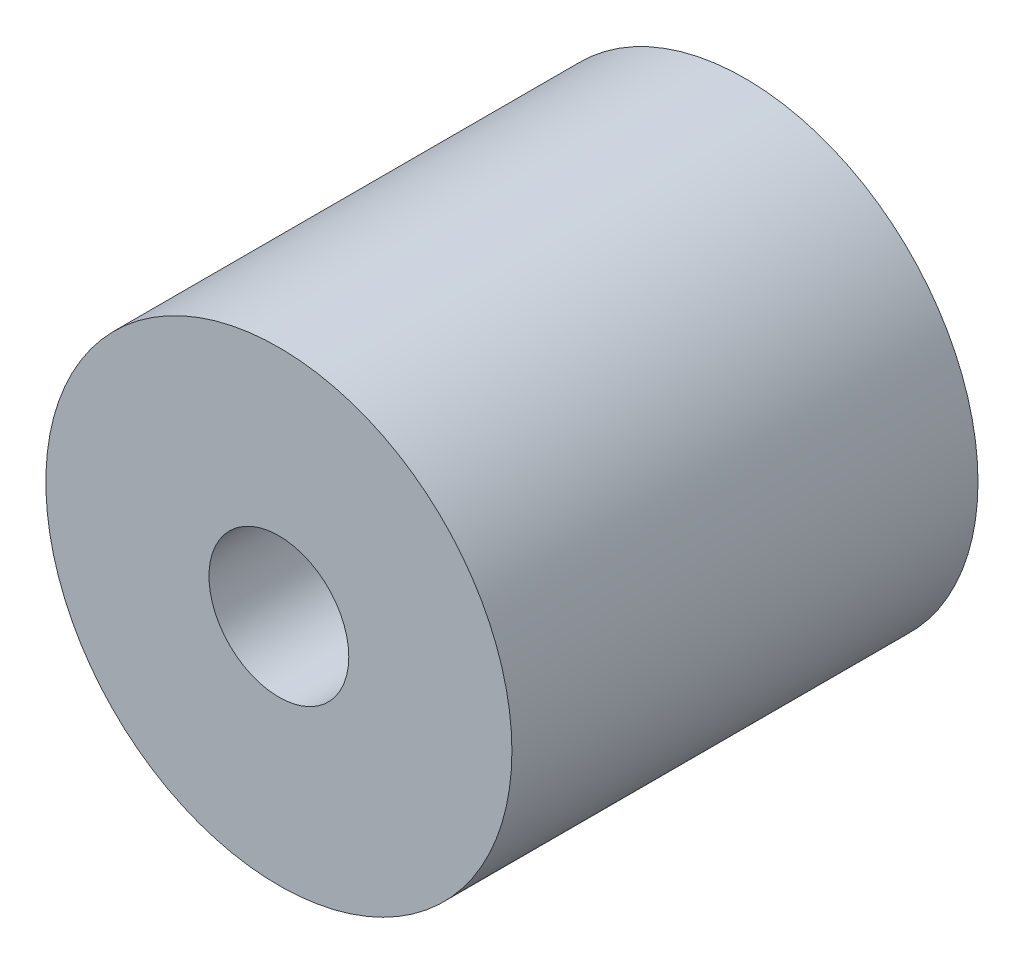
ISO-10303-21;
HEADER;
FILE_DESCRIPTION(('STEP AP214'),'2;1');
FILE_NAME('part.step','',(''),(''),'','','');
FILE_SCHEMA(('AUTOMOTIVE_DESIGN { 1 0 10303 214 1 1 1 1 }'));
ENDSEC;
DATA;
#1=APPLICATION_CONTEXT('core data for automotive mechanical design processes');
#2=APPLICATION_PROTOCOL_DEFINITION('international standard','automotive_design',2000,#1);
#3=PRODUCT_CONTEXT('',#1,'mechanical');
#4=PRODUCT('Part','Part','',(#3));
#5=PRODUCT_RELATED_PRODUCT_CATEGORY('part','',(#4));
#6=PRODUCT_DEFINITION_FORMATION('','',#4);
#7=PRODUCT_DEFINITION_CONTEXT('part definition',#1,'design');
#8=PRODUCT_DEFINITION('design','',#6,#7);
#9=PRODUCT_DEFINITION_SHAPE('','',#8);
#10=(LENGTH_UNIT() NAMED_UNIT(*) SI_UNIT(.MILLI.,.METRE.));
#11=(NAMED_UNIT(*) PLANE_ANGLE_UNIT() SI_UNIT($,.RADIAN.));
#12=(NAMED_UNIT(*) SI_UNIT($,.STERADIAN.) SOLID_ANGLE_UNIT());
#13=UNCERTAINTY_MEASURE_WITH_UNIT(LENGTH_MEASURE(1.E-05),#10,'distance_accuracy_value','');
#14=(GEOMETRIC_REPRESENTATION_CONTEXT(3) GLOBAL_UNCERTAINTY_ASSIGNED_CONTEXT((#13)) GLOBAL_UNIT_ASSIGNED_CONTEXT((#10,
#11,#12)) REPRESENTATION_CONTEXT('',''));
#15=CARTESIAN_POINT('',(0.,0.,0.));
#16=DIRECTION('',(0.,0.,1.));
#17=DIRECTION('',(1.,0.,0.));
#18=AXIS2_PLACEMENT_3D('',#15,#16,#17);
#19=CARTESIAN_POINT('',(0.,0.,10.));
#20=DIRECTION('',(0.,0.,1.));
#21=DIRECTION('',(1.,0.,0.));
#22=AXIS2_PLACEMENT_3D('',#19,#20,#21);
#23=PLANE('',#22);
#24=CARTESIAN_POINT('',(0.,0.,10.));
#25=DIRECTION('',(0.,0.,1.));
#26=DIRECTION('',(1.,0.,0.));
#27=AXIS2_PLACEMENT_3D('',#24,#25,#26);
#28=CIRCLE('',#27,5.);
#29=CARTESIAN_POINT('',(5.,0.,10.));
#30=VERTEX_POINT('',#29);
#31=EDGE_CURVE('E10',#30,#30,#28,.T.);
#32=ORIENTED_EDGE('',*,*,#31,.T.);
#33=EDGE_LOOP('',(#32));
#34=FACE_BOUND('',#33,.T.);
#35=CARTESIAN_POINT('',(0.,0.,10.));
#36=DIRECTION('',(0.,0.,1.));
#37=DIRECTION('',(1.,0.,0.));
#38=AXIS2_PLACEMENT_3D('',#35,#36,#37);
#39=CIRCLE('',#38,1.5);
#40=CARTESIAN_POINT('',(1.5,0.,10.));
#41=VERTEX_POINT('',#40);
#42=EDGE_CURVE('E43',#41,#41,#39,.T.);
#43=ORIENTED_EDGE('',*,*,#42,.F.);
#44=EDGE_LOOP('',(#43));
#45=FACE_BOUND('',#44,.T.);
#46=ADVANCED_FACE('F32',(#34,#45),#23,.T.);
#47=CARTESIAN_POINT('',(0.,0.,0.));
#48=DIRECTION('',(0.,0.,1.));
#49=DIRECTION('',(1.,0.,0.));
#50=AXIS2_PLACEMENT_3D('',#47,#48,#49);
#51=PLANE('',#50);
#52=CARTESIAN_POINT('',(0.,0.,0.));
#53=DIRECTION('',(0.,0.,1.));
#54=DIRECTION('',(1.,0.,0.));
#55=AXIS2_PLACEMENT_3D('',#52,#53,#54);
#56=CIRCLE('',#55,5.);
#57=CARTESIAN_POINT('',(5.,0.,0.));
#58=VERTEX_POINT('',#57);
#59=EDGE_CURVE('E36',#58,#58,#56,.T.);
#60=ORIENTED_EDGE('',*,*,#59,.F.);
#61=EDGE_LOOP('',(#60));
#62=FACE_BOUND('',#61,.T.);
#63=CARTESIAN_POINT('',(0.,0.,0.));
#64=DIRECTION('',(0.,0.,1.));
#65=DIRECTION('',(1.,0.,0.));
#66=AXIS2_PLACEMENT_3D('',#63,#64,#65);
#67=CIRCLE('',#66,1.5);
#68=CARTESIAN_POINT('',(1.5,0.,0.));
#69=VERTEX_POINT('',#68);
#70=EDGE_CURVE('E45',#69,#69,#67,.T.);
#71=ORIENTED_EDGE('',*,*,#70,.T.);
#72=EDGE_LOOP('',(#71));
#73=FACE_BOUND('',#72,.T.);
#74=ADVANCED_FACE('F55',(#62,#73),#51,.F.);
#75=CARTESIAN_POINT('',(0.,0.,10.));
#76=DIRECTION('',(0.,0.,-1.));
#77=DIRECTION('',(-1.,0.,0.));
#78=AXIS2_PLACEMENT_3D('',#75,#76,#77);
#79=CYLINDRICAL_SURFACE('',#78,5.);
#80=ORIENTED_EDGE('',*,*,#31,.F.);
#81=EDGE_LOOP('',(#80));
#82=FACE_BOUND('',#81,.T.);
#83=ORIENTED_EDGE('',*,*,#59,.T.);
#84=EDGE_LOOP('',(#83));
#85=FACE_BOUND('',#84,.T.);
#86=ADVANCED_FACE('F34',(#82,#85),#79,.T.);
#87=CARTESIAN_POINT('',(0.,0.,10.));
#88=DIRECTION('',(0.,0.,-1.));
#89=DIRECTION('',(-1.,0.,0.));
#90=AXIS2_PLACEMENT_3D('',#87,#88,#89);
#91=CYLINDRICAL_SURFACE('',#90,1.5);
#92=ORIENTED_EDGE('',*,*,#42,.T.);
#93=EDGE_LOOP('',(#92));
#94=FACE_BOUND('',#93,.T.);
#95=ORIENTED_EDGE('',*,*,#70,.F.);
#96=EDGE_LOOP('',(#95));
#97=FACE_BOUND('',#96,.T.);
#98=ADVANCED_FACE('F51',(#94,#97),#91,.F.);
#99=CLOSED_SHELL('',(#46,#74,#86,#98));
#100=MANIFOLD_SOLID_BREP('B2',#99);
#101=ADVANCED_BREP_SHAPE_REPRESENTATION('',(#18,#100),#14);
#102=SHAPE_DEFINITION_REPRESENTATION(#9,#101);
ENDSEC;
END-ISO-10303-21;
